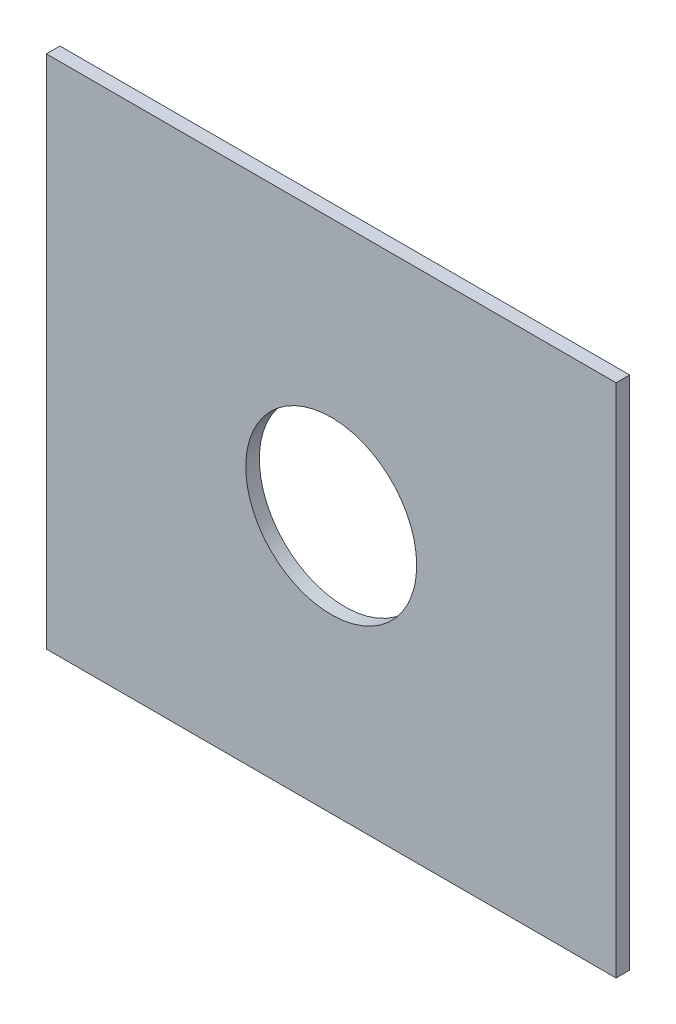
ISO-10303-21;
HEADER;
FILE_DESCRIPTION(('STEP AP214'),'2;1');
FILE_NAME('part.step','',(''),(''),'','','');
FILE_SCHEMA(('AUTOMOTIVE_DESIGN { 1 0 10303 214 1 1 1 1 }'));
ENDSEC;
DATA;
#1=APPLICATION_CONTEXT('core data for automotive mechanical design processes');
#2=APPLICATION_PROTOCOL_DEFINITION('international standard','automotive_design',2000,#1);
#3=PRODUCT_CONTEXT('',#1,'mechanical');
#4=PRODUCT('Part','Part','',(#3));
#5=PRODUCT_RELATED_PRODUCT_CATEGORY('part','',(#4));
#6=PRODUCT_DEFINITION_FORMATION('','',#4);
#7=PRODUCT_DEFINITION_CONTEXT('part definition',#1,'design');
#8=PRODUCT_DEFINITION('design','',#6,#7);
#9=PRODUCT_DEFINITION_SHAPE('','',#8);
#10=(LENGTH_UNIT() NAMED_UNIT(*) SI_UNIT(.MILLI.,.METRE.));
#11=(NAMED_UNIT(*) PLANE_ANGLE_UNIT() SI_UNIT($,.RADIAN.));
#12=(NAMED_UNIT(*) SI_UNIT($,.STERADIAN.) SOLID_ANGLE_UNIT());
#13=UNCERTAINTY_MEASURE_WITH_UNIT(LENGTH_MEASURE(1.E-05),#10,'distance_accuracy_value','');
#14=(GEOMETRIC_REPRESENTATION_CONTEXT(3) GLOBAL_UNCERTAINTY_ASSIGNED_CONTEXT((#13)) GLOBAL_UNIT_ASSIGNED_CONTEXT((#10,
#11,#12)) REPRESENTATION_CONTEXT('',''));
#15=CARTESIAN_POINT('',(0.,0.,0.));
#16=DIRECTION('',(0.,0.,1.));
#17=DIRECTION('',(1.,0.,0.));
#18=AXIS2_PLACEMENT_3D('',#15,#16,#17);
#19=CARTESIAN_POINT('',(0.,0.,1.));
#20=DIRECTION('',(0.,0.,1.));
#21=DIRECTION('',(1.,0.,0.));
#22=AXIS2_PLACEMENT_3D('',#19,#20,#21);
#23=PLANE('',#22);
#24=DIRECTION('',(0.,-1.,0.));
#25=VECTOR('',#24,1.);
#26=CARTESIAN_POINT('',(-21.,47.5,1.));
#27=LINE('',#26,#25);
#28=CARTESIAN_POINT('',(-21.,47.5,1.));
#29=VERTEX_POINT('',#28);
#30=CARTESIAN_POINT('',(-21.,9.5,1.));
#31=VERTEX_POINT('',#30);
#32=EDGE_CURVE('E98',#29,#31,#27,.T.);
#33=ORIENTED_EDGE('',*,*,#32,.T.);
#34=DIRECTION('',(1.,0.,0.));
#35=VECTOR('',#34,1.);
#36=CARTESIAN_POINT('',(-21.,9.5,1.));
#37=LINE('',#36,#35);
#38=CARTESIAN_POINT('',(21.,9.5,1.));
#39=VERTEX_POINT('',#38);
#40=EDGE_CURVE('E93',#31,#39,#37,.T.);
#41=ORIENTED_EDGE('',*,*,#40,.T.);
#42=DIRECTION('',(0.,1.,0.));
#43=VECTOR('',#42,1.);
#44=CARTESIAN_POINT('',(21.,9.5,1.));
#45=LINE('',#44,#43);
#46=CARTESIAN_POINT('',(21.,47.5,1.));
#47=VERTEX_POINT('',#46);
#48=EDGE_CURVE('E96',#39,#47,#45,.T.);
#49=ORIENTED_EDGE('',*,*,#48,.T.);
#50=DIRECTION('',(-1.,0.,0.));
#51=VECTOR('',#50,1.);
#52=CARTESIAN_POINT('',(21.,47.5,1.));
#53=LINE('',#52,#51);
#54=EDGE_CURVE('E63',#47,#29,#53,.T.);
#55=ORIENTED_EDGE('',*,*,#54,.T.);
#56=EDGE_LOOP('',(#33,#41,#49,#55));
#57=FACE_BOUND('',#56,.T.);
#58=CARTESIAN_POINT('',(0.,28.5,1.));
#59=DIRECTION('',(0.,0.,1.));
#60=DIRECTION('',(1.,0.,0.));
#61=AXIS2_PLACEMENT_3D('',#58,#59,#60);
#62=CIRCLE('',#61,6.3);
#63=CARTESIAN_POINT('',(6.3,28.5,1.));
#64=VERTEX_POINT('',#63);
#65=EDGE_CURVE('E120',#64,#64,#62,.T.);
#66=ORIENTED_EDGE('',*,*,#65,.F.);
#67=EDGE_LOOP('',(#66));
#68=FACE_BOUND('',#67,.T.);
#69=ADVANCED_FACE('F45',(#57,#68),#23,.T.);
#70=CARTESIAN_POINT('',(0.,0.,0.));
#71=DIRECTION('',(0.,0.,1.));
#72=DIRECTION('',(1.,0.,0.));
#73=AXIS2_PLACEMENT_3D('',#70,#71,#72);
#74=PLANE('',#73);
#75=DIRECTION('',(0.,-1.,0.));
#76=VECTOR('',#75,1.);
#77=CARTESIAN_POINT('',(-21.,47.5,0.));
#78=LINE('',#77,#76);
#79=CARTESIAN_POINT('',(-21.,47.5,0.));
#80=VERTEX_POINT('',#79);
#81=CARTESIAN_POINT('',(-21.,9.5,0.));
#82=VERTEX_POINT('',#81);
#83=EDGE_CURVE('E116',#80,#82,#78,.T.);
#84=ORIENTED_EDGE('',*,*,#83,.F.);
#85=DIRECTION('',(-1.,0.,0.));
#86=VECTOR('',#85,1.);
#87=CARTESIAN_POINT('',(21.,47.5,0.));
#88=LINE('',#87,#86);
#89=CARTESIAN_POINT('',(21.,47.5,0.));
#90=VERTEX_POINT('',#89);
#91=EDGE_CURVE('E86',#90,#80,#88,.T.);
#92=ORIENTED_EDGE('',*,*,#91,.F.);
#93=DIRECTION('',(0.,1.,0.));
#94=VECTOR('',#93,1.);
#95=CARTESIAN_POINT('',(21.,9.5,0.));
#96=LINE('',#95,#94);
#97=CARTESIAN_POINT('',(21.,9.5,0.));
#98=VERTEX_POINT('',#97);
#99=EDGE_CURVE('E80',#98,#90,#96,.T.);
#100=ORIENTED_EDGE('',*,*,#99,.F.);
#101=DIRECTION('',(1.,0.,0.));
#102=VECTOR('',#101,1.);
#103=CARTESIAN_POINT('',(-21.,9.5,0.));
#104=LINE('',#103,#102);
#105=EDGE_CURVE('E103',#82,#98,#104,.T.);
#106=ORIENTED_EDGE('',*,*,#105,.F.);
#107=EDGE_LOOP('',(#84,#92,#100,#106));
#108=FACE_BOUND('',#107,.T.);
#109=CARTESIAN_POINT('',(0.,28.5,0.));
#110=DIRECTION('',(0.,0.,1.));
#111=DIRECTION('',(1.,0.,0.));
#112=AXIS2_PLACEMENT_3D('',#109,#110,#111);
#113=CIRCLE('',#112,6.3);
#114=CARTESIAN_POINT('',(6.3,28.5,0.));
#115=VERTEX_POINT('',#114);
#116=EDGE_CURVE('E137',#115,#115,#113,.T.);
#117=ORIENTED_EDGE('',*,*,#116,.T.);
#118=EDGE_LOOP('',(#117));
#119=FACE_BOUND('',#118,.T.);
#120=ADVANCED_FACE('F132',(#108,#119),#74,.F.);
#121=CARTESIAN_POINT('',(-21.,47.5,1.));
#122=DIRECTION('',(1.,0.,0.));
#123=DIRECTION('',(0.,0.,-1.));
#124=AXIS2_PLACEMENT_3D('',#121,#122,#123);
#125=PLANE('',#124);
#126=ORIENTED_EDGE('',*,*,#83,.T.);
#127=DIRECTION('',(0.,0.,-1.));
#128=VECTOR('',#127,1.);
#129=CARTESIAN_POINT('',(-21.,9.5,1.));
#130=LINE('',#129,#128);
#131=EDGE_CURVE('E11',#31,#82,#130,.T.);
#132=ORIENTED_EDGE('',*,*,#131,.F.);
#133=ORIENTED_EDGE('',*,*,#32,.F.);
#134=DIRECTION('',(0.,0.,-1.));
#135=VECTOR('',#134,1.);
#136=CARTESIAN_POINT('',(-21.,47.5,1.));
#137=LINE('',#136,#135);
#138=EDGE_CURVE('E112',#29,#80,#137,.T.);
#139=ORIENTED_EDGE('',*,*,#138,.T.);
#140=EDGE_LOOP('',(#126,#132,#133,#139));
#141=FACE_BOUND('',#140,.T.);
#142=ADVANCED_FACE('F47',(#141),#125,.F.);
#143=CARTESIAN_POINT('',(-21.,9.5,1.));
#144=DIRECTION('',(0.,1.,0.));
#145=DIRECTION('',(0.,0.,1.));
#146=AXIS2_PLACEMENT_3D('',#143,#144,#145);
#147=PLANE('',#146);
#148=ORIENTED_EDGE('',*,*,#105,.T.);
#149=DIRECTION('',(0.,0.,-1.));
#150=VECTOR('',#149,1.);
#151=CARTESIAN_POINT('',(21.,9.5,1.));
#152=LINE('',#151,#150);
#153=EDGE_CURVE('E55',#39,#98,#152,.T.);
#154=ORIENTED_EDGE('',*,*,#153,.F.);
#155=ORIENTED_EDGE('',*,*,#40,.F.);
#156=ORIENTED_EDGE('',*,*,#131,.T.);
#157=EDGE_LOOP('',(#148,#154,#155,#156));
#158=FACE_BOUND('',#157,.T.);
#159=ADVANCED_FACE('F102',(#158),#147,.F.);
#160=CARTESIAN_POINT('',(21.,9.5,1.));
#161=DIRECTION('',(-1.,0.,0.));
#162=DIRECTION('',(0.,0.,1.));
#163=AXIS2_PLACEMENT_3D('',#160,#161,#162);
#164=PLANE('',#163);
#165=ORIENTED_EDGE('',*,*,#99,.T.);
#166=DIRECTION('',(0.,0.,-1.));
#167=VECTOR('',#166,1.);
#168=CARTESIAN_POINT('',(21.,47.5,1.));
#169=LINE('',#168,#167);
#170=EDGE_CURVE('E105',#47,#90,#169,.T.);
#171=ORIENTED_EDGE('',*,*,#170,.F.);
#172=ORIENTED_EDGE('',*,*,#48,.F.);
#173=ORIENTED_EDGE('',*,*,#153,.T.);
#174=EDGE_LOOP('',(#165,#171,#172,#173));
#175=FACE_BOUND('',#174,.T.);
#176=ADVANCED_FACE('F106',(#175),#164,.F.);
#177=CARTESIAN_POINT('',(21.,47.5,1.));
#178=DIRECTION('',(0.,-1.,0.));
#179=DIRECTION('',(0.,0.,-1.));
#180=AXIS2_PLACEMENT_3D('',#177,#178,#179);
#181=PLANE('',#180);
#182=ORIENTED_EDGE('',*,*,#91,.T.);
#183=ORIENTED_EDGE('',*,*,#138,.F.);
#184=ORIENTED_EDGE('',*,*,#54,.F.);
#185=ORIENTED_EDGE('',*,*,#170,.T.);
#186=EDGE_LOOP('',(#182,#183,#184,#185));
#187=FACE_BOUND('',#186,.T.);
#188=ADVANCED_FACE('F129',(#187),#181,.F.);
#189=CARTESIAN_POINT('',(0.,28.5,1.));
#190=DIRECTION('',(0.,0.,-1.));
#191=DIRECTION('',(-1.,0.,0.));
#192=AXIS2_PLACEMENT_3D('',#189,#190,#191);
#193=CYLINDRICAL_SURFACE('',#192,6.3);
#194=ORIENTED_EDGE('',*,*,#65,.T.);
#195=EDGE_LOOP('',(#194));
#196=FACE_BOUND('',#195,.T.);
#197=ORIENTED_EDGE('',*,*,#116,.F.);
#198=EDGE_LOOP('',(#197));
#199=FACE_BOUND('',#198,.T.);
#200=ADVANCED_FACE('F144',(#196,#199),#193,.F.);
#201=CLOSED_SHELL('',(#69,#120,#142,#159,#176,#188,#200));
#202=MANIFOLD_SOLID_BREP('B2',#201);
#203=ADVANCED_BREP_SHAPE_REPRESENTATION('',(#18,#202),#14);
#204=SHAPE_DEFINITION_REPRESENTATION(#9,#203);
ENDSEC;
END-ISO-10303-21;
